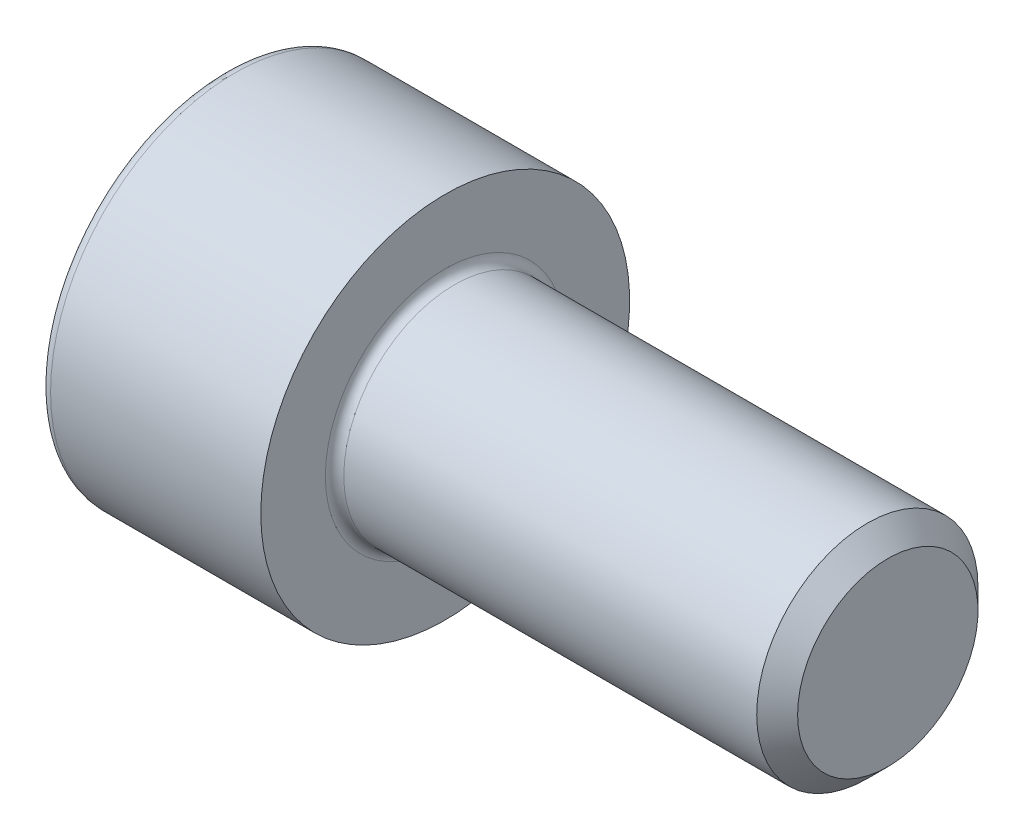
ISO-10303-21;
HEADER;
FILE_DESCRIPTION(('STEP AP214'),'2;1');
FILE_NAME('part.step','',(''),(''),'','','');
FILE_SCHEMA(('AUTOMOTIVE_DESIGN { 1 0 10303 214 1 1 1 1 }'));
ENDSEC;
DATA;
#1=APPLICATION_CONTEXT('core data for automotive mechanical design processes');
#2=APPLICATION_PROTOCOL_DEFINITION('international standard','automotive_design',2000,#1);
#3=PRODUCT_CONTEXT('',#1,'mechanical');
#4=PRODUCT('Part','Part','',(#3));
#5=PRODUCT_RELATED_PRODUCT_CATEGORY('part','',(#4));
#6=PRODUCT_DEFINITION_FORMATION('','',#4);
#7=PRODUCT_DEFINITION_CONTEXT('part definition',#1,'design');
#8=PRODUCT_DEFINITION('design','',#6,#7);
#9=PRODUCT_DEFINITION_SHAPE('','',#8);
#10=(LENGTH_UNIT() NAMED_UNIT(*) SI_UNIT(.MILLI.,.METRE.));
#11=(NAMED_UNIT(*) PLANE_ANGLE_UNIT() SI_UNIT($,.RADIAN.));
#12=(NAMED_UNIT(*) SI_UNIT($,.STERADIAN.) SOLID_ANGLE_UNIT());
#13=UNCERTAINTY_MEASURE_WITH_UNIT(LENGTH_MEASURE(1.E-05),#10,'distance_accuracy_value','');
#14=(GEOMETRIC_REPRESENTATION_CONTEXT(3) GLOBAL_UNCERTAINTY_ASSIGNED_CONTEXT((#13)) GLOBAL_UNIT_ASSIGNED_CONTEXT((#10,
#11,#12)) REPRESENTATION_CONTEXT('',''));
#15=CARTESIAN_POINT('',(0.,0.,0.));
#16=DIRECTION('',(0.,0.,1.));
#17=DIRECTION('',(1.,0.,0.));
#18=AXIS2_PLACEMENT_3D('',#15,#16,#17);
#19=CARTESIAN_POINT('',(3.,2.88675134594813,0.));
#20=DIRECTION('',(1.,0.,0.));
#21=DIRECTION('',(0.,0.,-1.));
#22=AXIS2_PLACEMENT_3D('',#19,#20,#21);
#23=PLANE('',#22);
#24=CARTESIAN_POINT('',(3.,0.,0.));
#25=DIRECTION('',(1.,0.,0.));
#26=DIRECTION('',(0.,0.,-1.));
#27=AXIS2_PLACEMENT_3D('',#24,#25,#26);
#28=CIRCLE('',#27,2.5);
#29=CARTESIAN_POINT('',(3.,0.,-2.5));
#30=VERTEX_POINT('',#29);
#31=CARTESIAN_POINT('',(3.,-2.1650635094611,-1.25));
#32=VERTEX_POINT('',#31);
#33=EDGE_CURVE('E11',#30,#32,#28,.F.);
#34=ORIENTED_EDGE('',*,*,#33,.F.);
#35=DIRECTION('',(0.,1.,0.));
#36=VECTOR('',#35,1.);
#37=CARTESIAN_POINT('',(3.,-1.44337567297407,-2.5));
#38=LINE('',#37,#36);
#39=CARTESIAN_POINT('',(3.,-1.44337567297407,-2.5));
#40=VERTEX_POINT('',#39);
#41=EDGE_CURVE('E184',#40,#30,#38,.T.);
#42=ORIENTED_EDGE('',*,*,#41,.F.);
#43=DIRECTION('',(0.,0.5,-0.866025403784439));
#44=VECTOR('',#43,1.);
#45=CARTESIAN_POINT('',(3.,-2.88675134594813,0.));
#46=LINE('',#45,#44);
#47=EDGE_CURVE('E180',#32,#40,#46,.T.);
#48=ORIENTED_EDGE('',*,*,#47,.F.);
#49=EDGE_LOOP('',(#34,#42,#48));
#50=FACE_BOUND('',#49,.T.);
#51=ADVANCED_FACE('F39',(#50),#23,.F.);
#52=CARTESIAN_POINT('',(3.,-2.1650635094611,1.25));
#53=VERTEX_POINT('',#52);
#54=EDGE_CURVE('E48',#32,#53,#28,.F.);
#55=ORIENTED_EDGE('',*,*,#54,.F.);
#56=CARTESIAN_POINT('',(3.,-2.88675134594813,0.));
#57=VERTEX_POINT('',#56);
#58=EDGE_CURVE('E181',#57,#32,#46,.T.);
#59=ORIENTED_EDGE('',*,*,#58,.F.);
#60=DIRECTION('',(0.,-0.5,-0.866025403784439));
#61=VECTOR('',#60,1.);
#62=CARTESIAN_POINT('',(3.,-1.44337567297407,2.5));
#63=LINE('',#62,#61);
#64=EDGE_CURVE('E176',#53,#57,#63,.T.);
#65=ORIENTED_EDGE('',*,*,#64,.F.);
#66=EDGE_LOOP('',(#55,#59,#65));
#67=FACE_BOUND('',#66,.T.);
#68=ADVANCED_FACE('F123',(#67),#23,.F.);
#69=CARTESIAN_POINT('',(3.,0.,2.5));
#70=VERTEX_POINT('',#69);
#71=EDGE_CURVE('E259',#53,#70,#28,.F.);
#72=ORIENTED_EDGE('',*,*,#71,.F.);
#73=CARTESIAN_POINT('',(3.,-1.44337567297407,2.5));
#74=VERTEX_POINT('',#73);
#75=EDGE_CURVE('E177',#74,#53,#63,.T.);
#76=ORIENTED_EDGE('',*,*,#75,.F.);
#77=DIRECTION('',(0.,-1.,0.));
#78=VECTOR('',#77,1.);
#79=CARTESIAN_POINT('',(3.,1.44337567297406,2.5));
#80=LINE('',#79,#78);
#81=EDGE_CURVE('E172',#70,#74,#80,.T.);
#82=ORIENTED_EDGE('',*,*,#81,.F.);
#83=EDGE_LOOP('',(#72,#76,#82));
#84=FACE_BOUND('',#83,.T.);
#85=ADVANCED_FACE('F130',(#84),#23,.F.);
#86=CARTESIAN_POINT('',(3.,0.,0.));
#87=DIRECTION('',(-1.,0.,0.));
#88=DIRECTION('',(0.,0.,1.));
#89=AXIS2_PLACEMENT_3D('',#86,#87,#88);
#90=CIRCLE('',#89,2.5);
#91=CARTESIAN_POINT('',(3.,2.1650635094611,1.25));
#92=VERTEX_POINT('',#91);
#93=EDGE_CURVE('E170',#70,#92,#90,.T.);
#94=ORIENTED_EDGE('',*,*,#93,.F.);
#95=CARTESIAN_POINT('',(3.,1.44337567297406,2.5));
#96=VERTEX_POINT('',#95);
#97=EDGE_CURVE('E173',#96,#70,#80,.T.);
#98=ORIENTED_EDGE('',*,*,#97,.F.);
#99=DIRECTION('',(0.,-0.5,0.866025403784439));
#100=VECTOR('',#99,1.);
#101=CARTESIAN_POINT('',(3.,2.88675134594813,0.));
#102=LINE('',#101,#100);
#103=EDGE_CURVE('E167',#92,#96,#102,.T.);
#104=ORIENTED_EDGE('',*,*,#103,.F.);
#105=EDGE_LOOP('',(#94,#98,#104));
#106=FACE_BOUND('',#105,.T.);
#107=ADVANCED_FACE('F144',(#106),#23,.F.);
#108=CARTESIAN_POINT('',(3.,2.1650635094611,-1.25));
#109=VERTEX_POINT('',#108);
#110=EDGE_CURVE('E55',#92,#109,#28,.F.);
#111=ORIENTED_EDGE('',*,*,#110,.F.);
#112=CARTESIAN_POINT('',(3.,2.88675134594813,0.));
#113=VERTEX_POINT('',#112);
#114=EDGE_CURVE('E158',#113,#92,#102,.T.);
#115=ORIENTED_EDGE('',*,*,#114,.F.);
#116=DIRECTION('',(0.,0.5,0.866025403784439));
#117=VECTOR('',#116,1.);
#118=CARTESIAN_POINT('',(3.,1.44337567297406,-2.5));
#119=LINE('',#118,#117);
#120=EDGE_CURVE('E155',#109,#113,#119,.T.);
#121=ORIENTED_EDGE('',*,*,#120,.F.);
#122=EDGE_LOOP('',(#111,#115,#121));
#123=FACE_BOUND('',#122,.T.);
#124=ADVANCED_FACE('F135',(#123),#23,.F.);
#125=EDGE_CURVE('E43',#109,#30,#28,.F.);
#126=ORIENTED_EDGE('',*,*,#125,.F.);
#127=CARTESIAN_POINT('',(3.,1.44337567297406,-2.5));
#128=VERTEX_POINT('',#127);
#129=EDGE_CURVE('E150',#128,#109,#119,.T.);
#130=ORIENTED_EDGE('',*,*,#129,.F.);
#131=EDGE_CURVE('E151',#30,#128,#38,.T.);
#132=ORIENTED_EDGE('',*,*,#131,.F.);
#133=EDGE_LOOP('',(#126,#130,#132));
#134=FACE_BOUND('',#133,.T.);
#135=ADVANCED_FACE('F125',(#134),#23,.F.);
#136=CARTESIAN_POINT('',(0.,0.,0.));
#137=DIRECTION('',(1.,0.,0.));
#138=DIRECTION('',(0.,0.,-1.));
#139=AXIS2_PLACEMENT_3D('',#136,#137,#138);
#140=PLANE('',#139);
#141=CARTESIAN_POINT('',(0.,0.,0.));
#142=DIRECTION('',(1.,0.,0.));
#143=DIRECTION('',(0.,0.,-1.));
#144=AXIS2_PLACEMENT_3D('',#141,#142,#143);
#145=CIRCLE('',#144,4.7);
#146=CARTESIAN_POINT('',(0.,0.,-4.7));
#147=VERTEX_POINT('',#146);
#148=EDGE_CURVE('E227',#147,#147,#145,.F.);
#149=ORIENTED_EDGE('',*,*,#148,.T.);
#150=EDGE_LOOP('',(#149));
#151=FACE_BOUND('',#150,.T.);
#152=DIRECTION('',(0.,0.5,0.866025403784439));
#153=VECTOR('',#152,1.);
#154=CARTESIAN_POINT('',(0.,1.44337567297406,-2.5));
#155=LINE('',#154,#153);
#156=CARTESIAN_POINT('',(0.,1.44337567297406,-2.5));
#157=VERTEX_POINT('',#156);
#158=CARTESIAN_POINT('',(0.,2.88675134594813,0.));
#159=VERTEX_POINT('',#158);
#160=EDGE_CURVE('E186',#157,#159,#155,.T.);
#161=ORIENTED_EDGE('',*,*,#160,.T.);
#162=DIRECTION('',(0.,-0.5,0.866025403784439));
#163=VECTOR('',#162,1.);
#164=CARTESIAN_POINT('',(0.,2.88675134594813,0.));
#165=LINE('',#164,#163);
#166=CARTESIAN_POINT('',(0.,1.44337567297406,2.5));
#167=VERTEX_POINT('',#166);
#168=EDGE_CURVE('E188',#159,#167,#165,.T.);
#169=ORIENTED_EDGE('',*,*,#168,.T.);
#170=DIRECTION('',(0.,-1.,0.));
#171=VECTOR('',#170,1.);
#172=CARTESIAN_POINT('',(0.,1.44337567297406,2.5));
#173=LINE('',#172,#171);
#174=CARTESIAN_POINT('',(0.,-1.44337567297407,2.5));
#175=VERTEX_POINT('',#174);
#176=EDGE_CURVE('E190',#167,#175,#173,.T.);
#177=ORIENTED_EDGE('',*,*,#176,.T.);
#178=DIRECTION('',(0.,-0.5,-0.866025403784439));
#179=VECTOR('',#178,1.);
#180=CARTESIAN_POINT('',(0.,-1.44337567297407,2.5));
#181=LINE('',#180,#179);
#182=CARTESIAN_POINT('',(0.,-2.88675134594813,0.));
#183=VERTEX_POINT('',#182);
#184=EDGE_CURVE('E192',#175,#183,#181,.T.);
#185=ORIENTED_EDGE('',*,*,#184,.T.);
#186=DIRECTION('',(0.,0.5,-0.866025403784439));
#187=VECTOR('',#186,1.);
#188=CARTESIAN_POINT('',(0.,-2.88675134594813,0.));
#189=LINE('',#188,#187);
#190=CARTESIAN_POINT('',(0.,-1.44337567297407,-2.5));
#191=VERTEX_POINT('',#190);
#192=EDGE_CURVE('E194',#183,#191,#189,.T.);
#193=ORIENTED_EDGE('',*,*,#192,.T.);
#194=DIRECTION('',(0.,1.,0.));
#195=VECTOR('',#194,1.);
#196=CARTESIAN_POINT('',(0.,-1.44337567297407,-2.5));
#197=LINE('',#196,#195);
#198=EDGE_CURVE('E63',#191,#157,#197,.T.);
#199=ORIENTED_EDGE('',*,*,#198,.T.);
#200=EDGE_LOOP('',(#161,#169,#177,#185,#193,#199));
#201=FACE_BOUND('',#200,.T.);
#202=ADVANCED_FACE('F134',(#151,#201),#140,.F.);
#203=CARTESIAN_POINT('',(0.,0.,0.));
#204=DIRECTION('',(-1.,0.,0.));
#205=DIRECTION('',(0.,0.,1.));
#206=AXIS2_PLACEMENT_3D('',#203,#204,#205);
#207=CYLINDRICAL_SURFACE('',#206,5.);
#208=CARTESIAN_POINT('',(0.3,0.,0.));
#209=DIRECTION('',(1.,0.,0.));
#210=DIRECTION('',(0.,0.,-1.));
#211=AXIS2_PLACEMENT_3D('',#208,#209,#210);
#212=CIRCLE('',#211,5.);
#213=CARTESIAN_POINT('',(0.3,0.,-5.));
#214=VERTEX_POINT('',#213);
#215=EDGE_CURVE('E153',#214,#214,#212,.T.);
#216=ORIENTED_EDGE('',*,*,#215,.T.);
#217=EDGE_LOOP('',(#216));
#218=FACE_BOUND('',#217,.T.);
#219=CARTESIAN_POINT('',(6.,0.,0.));
#220=DIRECTION('',(-1.,0.,0.));
#221=DIRECTION('',(0.,0.,1.));
#222=AXIS2_PLACEMENT_3D('',#219,#220,#221);
#223=CIRCLE('',#222,5.);
#224=CARTESIAN_POINT('',(6.,0.,5.));
#225=VERTEX_POINT('',#224);
#226=EDGE_CURVE('E218',#225,#225,#223,.T.);
#227=ORIENTED_EDGE('',*,*,#226,.T.);
#228=EDGE_LOOP('',(#227));
#229=FACE_BOUND('',#228,.T.);
#230=ADVANCED_FACE('F141',(#218,#229),#207,.T.);
#231=CARTESIAN_POINT('',(6.,5.,0.));
#232=DIRECTION('',(-1.,0.,0.));
#233=DIRECTION('',(0.,0.,1.));
#234=AXIS2_PLACEMENT_3D('',#231,#232,#233);
#235=PLANE('',#234);
#236=CARTESIAN_POINT('',(6.,0.,0.));
#237=DIRECTION('',(-1.,0.,0.));
#238=DIRECTION('',(0.,0.,1.));
#239=AXIS2_PLACEMENT_3D('',#236,#237,#238);
#240=CIRCLE('',#239,3.25);
#241=CARTESIAN_POINT('',(6.,0.,3.25));
#242=VERTEX_POINT('',#241);
#243=EDGE_CURVE('E221',#242,#242,#240,.T.);
#244=ORIENTED_EDGE('',*,*,#243,.T.);
#245=EDGE_LOOP('',(#244));
#246=FACE_BOUND('',#245,.T.);
#247=ORIENTED_EDGE('',*,*,#226,.F.);
#248=EDGE_LOOP('',(#247));
#249=FACE_BOUND('',#248,.T.);
#250=ADVANCED_FACE('F365',(#246,#249),#235,.F.);
#251=CARTESIAN_POINT('',(0.,0.,0.));
#252=DIRECTION('',(-1.,0.,0.));
#253=DIRECTION('',(0.,0.,1.));
#254=AXIS2_PLACEMENT_3D('',#251,#252,#253);
#255=CYLINDRICAL_SURFACE('',#254,3.);
#256=CARTESIAN_POINT('',(6.25,0.,0.));
#257=DIRECTION('',(-1.,0.,0.));
#258=DIRECTION('',(0.,0.,1.));
#259=AXIS2_PLACEMENT_3D('',#256,#257,#258);
#260=CIRCLE('',#259,3.);
#261=CARTESIAN_POINT('',(6.25,0.,3.));
#262=VERTEX_POINT('',#261);
#263=EDGE_CURVE('E224',#262,#262,#260,.F.);
#264=ORIENTED_EDGE('',*,*,#263,.T.);
#265=EDGE_LOOP('',(#264));
#266=FACE_BOUND('',#265,.T.);
#267=CARTESIAN_POINT('',(17.4455,0.,0.));
#268=DIRECTION('',(-1.,0.,0.));
#269=DIRECTION('',(0.,0.,1.));
#270=AXIS2_PLACEMENT_3D('',#267,#268,#269);
#271=CIRCLE('',#270,3.);
#272=CARTESIAN_POINT('',(17.4455,0.,3.));
#273=VERTEX_POINT('',#272);
#274=EDGE_CURVE('E215',#273,#273,#271,.T.);
#275=ORIENTED_EDGE('',*,*,#274,.T.);
#276=EDGE_LOOP('',(#275));
#277=FACE_BOUND('',#276,.T.);
#278=ADVANCED_FACE('F356',(#266,#277),#255,.T.);
#279=CARTESIAN_POINT('',(18.,0.,0.));
#280=DIRECTION('',(-1.,0.,0.));
#281=DIRECTION('',(0.,0.,1.));
#282=AXIS2_PLACEMENT_3D('',#279,#280,#281);
#283=CONICAL_SURFACE('',#282,2.4455,0.785398163397449);
#284=ORIENTED_EDGE('',*,*,#274,.F.);
#285=EDGE_LOOP('',(#284));
#286=FACE_BOUND('',#285,.T.);
#287=CARTESIAN_POINT('',(18.,0.,0.));
#288=DIRECTION('',(-1.,0.,0.));
#289=DIRECTION('',(0.,0.,1.));
#290=AXIS2_PLACEMENT_3D('',#287,#288,#289);
#291=CIRCLE('',#290,2.4455);
#292=CARTESIAN_POINT('',(18.,0.,2.4455));
#293=VERTEX_POINT('',#292);
#294=EDGE_CURVE('E212',#293,#293,#291,.T.);
#295=ORIENTED_EDGE('',*,*,#294,.T.);
#296=EDGE_LOOP('',(#295));
#297=FACE_BOUND('',#296,.T.);
#298=ADVANCED_FACE('F347',(#286,#297),#283,.T.);
#299=CARTESIAN_POINT('',(18.,2.4455,0.));
#300=DIRECTION('',(-1.,0.,0.));
#301=DIRECTION('',(0.,0.,1.));
#302=AXIS2_PLACEMENT_3D('',#299,#300,#301);
#303=PLANE('',#302);
#304=ORIENTED_EDGE('',*,*,#294,.F.);
#305=EDGE_LOOP('',(#304));
#306=FACE_BOUND('',#305,.T.);
#307=ADVANCED_FACE('F339',(#306),#303,.F.);
#308=CARTESIAN_POINT('',(6.25,0.,0.));
#309=DIRECTION('',(-1.,0.,0.));
#310=DIRECTION('',(0.,0.,1.));
#311=AXIS2_PLACEMENT_3D('',#308,#309,#310);
#312=TOROIDAL_SURFACE('',#311,3.25,0.25);
#313=ORIENTED_EDGE('',*,*,#263,.F.);
#314=EDGE_LOOP('',(#313));
#315=FACE_BOUND('',#314,.T.);
#316=ORIENTED_EDGE('',*,*,#243,.F.);
#317=EDGE_LOOP('',(#316));
#318=FACE_BOUND('',#317,.T.);
#319=ADVANCED_FACE('F235',(#315,#318),#312,.F.);
#320=CARTESIAN_POINT('',(0.3,0.,0.));
#321=DIRECTION('',(1.,0.,0.));
#322=DIRECTION('',(0.,0.,-1.));
#323=AXIS2_PLACEMENT_3D('',#320,#321,#322);
#324=TOROIDAL_SURFACE('',#323,4.7,0.3);
#325=ORIENTED_EDGE('',*,*,#215,.F.);
#326=EDGE_LOOP('',(#325));
#327=FACE_BOUND('',#326,.T.);
#328=ORIENTED_EDGE('',*,*,#148,.F.);
#329=EDGE_LOOP('',(#328));
#330=FACE_BOUND('',#329,.T.);
#331=ADVANCED_FACE('F41',(#327,#330),#324,.T.);
#332=CARTESIAN_POINT('',(3.,1.44337567297406,-2.5));
#333=DIRECTION('',(0.,-0.866025403784438,0.5));
#334=DIRECTION('',(0.,-0.5,-0.866025403784439));
#335=AXIS2_PLACEMENT_3D('',#332,#333,#334);
#336=PLANE('',#335);
#337=ORIENTED_EDGE('',*,*,#129,.T.);
#338=ORIENTED_EDGE('',*,*,#120,.T.);
#339=DIRECTION('',(-1.,0.,0.));
#340=VECTOR('',#339,1.);
#341=CARTESIAN_POINT('',(3.,2.88675134594813,0.));
#342=LINE('',#341,#340);
#343=EDGE_CURVE('E210',#113,#159,#342,.T.);
#344=ORIENTED_EDGE('',*,*,#343,.T.);
#345=ORIENTED_EDGE('',*,*,#160,.F.);
#346=DIRECTION('',(-1.,0.,0.));
#347=VECTOR('',#346,1.);
#348=CARTESIAN_POINT('',(3.,1.44337567297406,-2.5));
#349=LINE('',#348,#347);
#350=EDGE_CURVE('E166',#128,#157,#349,.T.);
#351=ORIENTED_EDGE('',*,*,#350,.F.);
#352=EDGE_LOOP('',(#337,#338,#344,#345,#351));
#353=FACE_BOUND('',#352,.T.);
#354=ADVANCED_FACE('F164',(#353),#336,.T.);
#355=CARTESIAN_POINT('',(3.,2.88675134594813,0.));
#356=DIRECTION('',(0.,-0.866025403784439,-0.5));
#357=DIRECTION('',(0.,0.5,-0.866025403784439));
#358=AXIS2_PLACEMENT_3D('',#355,#356,#357);
#359=PLANE('',#358);
#360=ORIENTED_EDGE('',*,*,#114,.T.);
#361=ORIENTED_EDGE('',*,*,#103,.T.);
#362=DIRECTION('',(-1.,0.,0.));
#363=VECTOR('',#362,1.);
#364=CARTESIAN_POINT('',(3.,1.44337567297406,2.5));
#365=LINE('',#364,#363);
#366=EDGE_CURVE('E207',#96,#167,#365,.T.);
#367=ORIENTED_EDGE('',*,*,#366,.T.);
#368=ORIENTED_EDGE('',*,*,#168,.F.);
#369=ORIENTED_EDGE('',*,*,#343,.F.);
#370=EDGE_LOOP('',(#360,#361,#367,#368,#369));
#371=FACE_BOUND('',#370,.T.);
#372=ADVANCED_FACE('F239',(#371),#359,.T.);
#373=CARTESIAN_POINT('',(3.,1.44337567297406,2.5));
#374=DIRECTION('',(0.,0.,-1.));
#375=DIRECTION('',(-1.,0.,0.));
#376=AXIS2_PLACEMENT_3D('',#373,#374,#375);
#377=PLANE('',#376);
#378=ORIENTED_EDGE('',*,*,#97,.T.);
#379=ORIENTED_EDGE('',*,*,#81,.T.);
#380=DIRECTION('',(-1.,0.,0.));
#381=VECTOR('',#380,1.);
#382=CARTESIAN_POINT('',(3.,-1.44337567297407,2.5));
#383=LINE('',#382,#381);
#384=EDGE_CURVE('E204',#74,#175,#383,.T.);
#385=ORIENTED_EDGE('',*,*,#384,.T.);
#386=ORIENTED_EDGE('',*,*,#176,.F.);
#387=ORIENTED_EDGE('',*,*,#366,.F.);
#388=EDGE_LOOP('',(#378,#379,#385,#386,#387));
#389=FACE_BOUND('',#388,.T.);
#390=ADVANCED_FACE('F244',(#389),#377,.T.);
#391=CARTESIAN_POINT('',(3.,-1.44337567297407,2.5));
#392=DIRECTION('',(0.,0.866025403784438,-0.5));
#393=DIRECTION('',(0.,0.5,0.866025403784439));
#394=AXIS2_PLACEMENT_3D('',#391,#392,#393);
#395=PLANE('',#394);
#396=ORIENTED_EDGE('',*,*,#75,.T.);
#397=ORIENTED_EDGE('',*,*,#64,.T.);
#398=DIRECTION('',(-1.,0.,0.));
#399=VECTOR('',#398,1.);
#400=CARTESIAN_POINT('',(3.,-2.88675134594813,0.));
#401=LINE('',#400,#399);
#402=EDGE_CURVE('E201',#57,#183,#401,.T.);
#403=ORIENTED_EDGE('',*,*,#402,.T.);
#404=ORIENTED_EDGE('',*,*,#184,.F.);
#405=ORIENTED_EDGE('',*,*,#384,.F.);
#406=EDGE_LOOP('',(#396,#397,#403,#404,#405));
#407=FACE_BOUND('',#406,.T.);
#408=ADVANCED_FACE('F250',(#407),#395,.T.);
#409=CARTESIAN_POINT('',(3.,-2.88675134594813,0.));
#410=DIRECTION('',(0.,0.866025403784439,0.5));
#411=DIRECTION('',(0.,-0.5,0.866025403784439));
#412=AXIS2_PLACEMENT_3D('',#409,#410,#411);
#413=PLANE('',#412);
#414=ORIENTED_EDGE('',*,*,#58,.T.);
#415=ORIENTED_EDGE('',*,*,#47,.T.);
#416=DIRECTION('',(-1.,0.,0.));
#417=VECTOR('',#416,1.);
#418=CARTESIAN_POINT('',(3.,-1.44337567297407,-2.5));
#419=LINE('',#418,#417);
#420=EDGE_CURVE('E198',#40,#191,#419,.T.);
#421=ORIENTED_EDGE('',*,*,#420,.T.);
#422=ORIENTED_EDGE('',*,*,#192,.F.);
#423=ORIENTED_EDGE('',*,*,#402,.F.);
#424=EDGE_LOOP('',(#414,#415,#421,#422,#423));
#425=FACE_BOUND('',#424,.T.);
#426=ADVANCED_FACE('F118',(#425),#413,.T.);
#427=CARTESIAN_POINT('',(3.,-1.44337567297407,-2.5));
#428=DIRECTION('',(0.,0.,1.));
#429=DIRECTION('',(1.,0.,0.));
#430=AXIS2_PLACEMENT_3D('',#427,#428,#429);
#431=PLANE('',#430);
#432=ORIENTED_EDGE('',*,*,#41,.T.);
#433=ORIENTED_EDGE('',*,*,#131,.T.);
#434=ORIENTED_EDGE('',*,*,#350,.T.);
#435=ORIENTED_EDGE('',*,*,#198,.F.);
#436=ORIENTED_EDGE('',*,*,#420,.F.);
#437=EDGE_LOOP('',(#432,#433,#434,#435,#436));
#438=FACE_BOUND('',#437,.T.);
#439=ADVANCED_FACE('F113',(#438),#431,.T.);
#440=CARTESIAN_POINT('',(4.44337567297408,0.,0.));
#441=DIRECTION('',(-1.,0.,0.));
#442=DIRECTION('',(0.,0.,1.));
#443=AXIS2_PLACEMENT_3D('',#440,#441,#442);
#444=CONICAL_SURFACE('',#443,0.,1.04719755119659);
#445=ORIENTED_EDGE('',*,*,#93,.T.);
#446=ORIENTED_EDGE('',*,*,#110,.T.);
#447=ORIENTED_EDGE('',*,*,#125,.T.);
#448=ORIENTED_EDGE('',*,*,#33,.T.);
#449=ORIENTED_EDGE('',*,*,#54,.T.);
#450=ORIENTED_EDGE('',*,*,#71,.T.);
#451=EDGE_LOOP('',(#445,#446,#447,#448,#449,#450));
#452=FACE_BOUND('',#451,.T.);
#453=CARTESIAN_POINT('',(4.44337567297408,0.,0.));
#454=VERTEX_POINT('',#453);
#455=VERTEX_LOOP('',#454);
#456=FACE_BOUND('',#455,.T.);
#457=ADVANCED_FACE('F111',(#452,#456),#444,.F.);
#458=CLOSED_SHELL('',(#51,#68,#85,#107,#124,#135,#202,#230,#250,#278,#298,#307,#319,#331,#354,
#372,#390,#408,#426,#439,#457));
#459=MANIFOLD_SOLID_BREP('B2',#458);
#460=ADVANCED_BREP_SHAPE_REPRESENTATION('',(#18,#459),#14);
#461=SHAPE_DEFINITION_REPRESENTATION(#9,#460);
ENDSEC;
END-ISO-10303-21;
